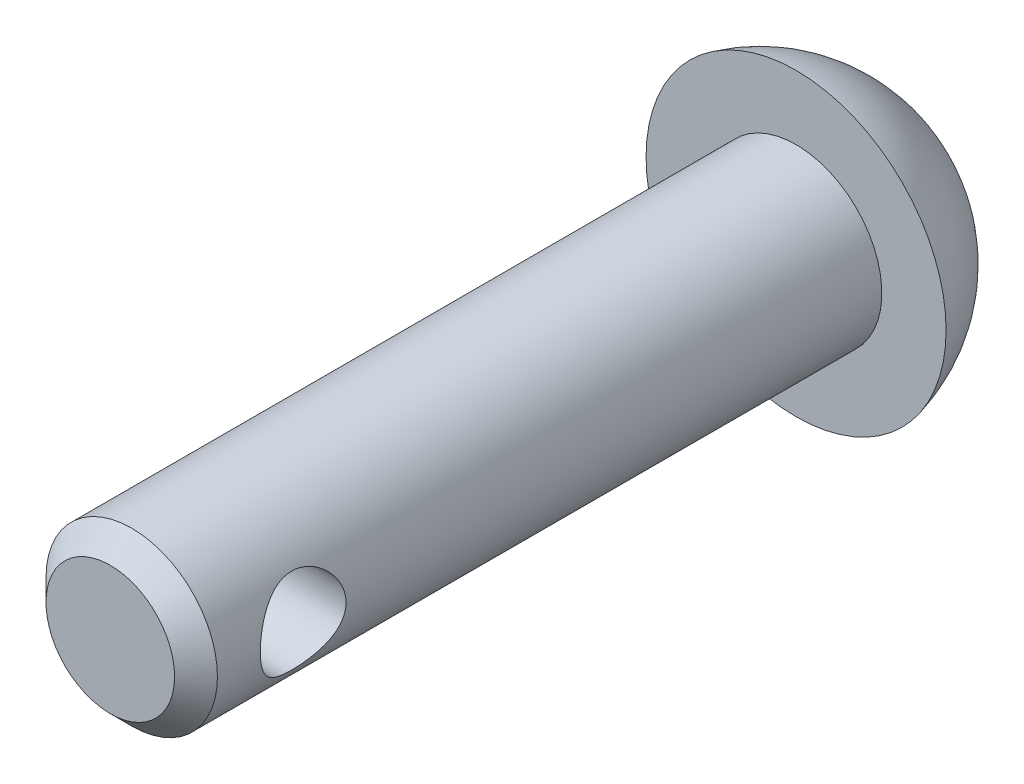
ISO-10303-21;
HEADER;
FILE_DESCRIPTION(('STEP AP214'),'2;1');
FILE_NAME('part.step','',(''),(''),'','','');
FILE_SCHEMA(('AUTOMOTIVE_DESIGN { 1 0 10303 214 1 1 1 1 }'));
ENDSEC;
DATA;
#1=APPLICATION_CONTEXT('core data for automotive mechanical design processes');
#2=APPLICATION_PROTOCOL_DEFINITION('international standard','automotive_design',2000,#1);
#3=PRODUCT_CONTEXT('',#1,'mechanical');
#4=PRODUCT('Part','Part','',(#3));
#5=PRODUCT_RELATED_PRODUCT_CATEGORY('part','',(#4));
#6=PRODUCT_DEFINITION_FORMATION('','',#4);
#7=PRODUCT_DEFINITION_CONTEXT('part definition',#1,'design');
#8=PRODUCT_DEFINITION('design','',#6,#7);
#9=PRODUCT_DEFINITION_SHAPE('','',#8);
#10=(LENGTH_UNIT() NAMED_UNIT(*) SI_UNIT(.MILLI.,.METRE.));
#11=(NAMED_UNIT(*) PLANE_ANGLE_UNIT() SI_UNIT($,.RADIAN.));
#12=(NAMED_UNIT(*) SI_UNIT($,.STERADIAN.) SOLID_ANGLE_UNIT());
#13=UNCERTAINTY_MEASURE_WITH_UNIT(LENGTH_MEASURE(1.E-05),#10,'distance_accuracy_value','');
#14=(GEOMETRIC_REPRESENTATION_CONTEXT(3) GLOBAL_UNCERTAINTY_ASSIGNED_CONTEXT((#13)) GLOBAL_UNIT_ASSIGNED_CONTEXT((#10,
#11,#12)) REPRESENTATION_CONTEXT('',''));
#15=CARTESIAN_POINT('',(0.,0.,0.));
#16=DIRECTION('',(0.,0.,1.));
#17=DIRECTION('',(1.,0.,0.));
#18=AXIS2_PLACEMENT_3D('',#15,#16,#17);
#19=CARTESIAN_POINT('',(0.,0.,8.));
#20=DIRECTION('',(0.,0.,-1.));
#21=DIRECTION('',(-1.,0.,0.));
#22=AXIS2_PLACEMENT_3D('',#19,#20,#21);
#23=CYLINDRICAL_SURFACE('',#22,2.);
#24=CARTESIAN_POINT('',(0.,0.,7.5));
#25=DIRECTION('',(0.,0.,1.));
#26=DIRECTION('',(1.,0.,0.));
#27=AXIS2_PLACEMENT_3D('',#24,#25,#26);
#28=CIRCLE('',#27,2.);
#29=CARTESIAN_POINT('',(2.,0.,7.5));
#30=VERTEX_POINT('',#29);
#31=EDGE_CURVE('E10',#30,#30,#28,.F.);
#32=ORIENTED_EDGE('',*,*,#31,.T.);
#33=EDGE_LOOP('',(#32));
#34=FACE_BOUND('',#33,.T.);
#35=CARTESIAN_POINT('',(-2.,0.,6.5));
#36=CARTESIAN_POINT('',(-1.99999713404151,-0.0525719629529865,6.4999966976805));
#37=CARTESIAN_POINT('',(-1.99790491019518,-0.105206599698033,6.49582992687832));
#38=CARTESIAN_POINT('',(-1.98974156037396,-0.208920235268425,6.47934711965908));
#39=CARTESIAN_POINT('',(-1.98366287828984,-0.259996086713504,6.46701560700235));
#40=CARTESIAN_POINT('',(-1.96816279403312,-0.358933544880574,6.4348061913832));
#41=CARTESIAN_POINT('',(-1.9587543917752,-0.40680680293918,6.41495761575199));
#42=CARTESIAN_POINT('',(-1.93745776515779,-0.498472616806565,6.36842937863506));
#43=CARTESIAN_POINT('',(-1.9255697363353,-0.54226549399005,6.34175025575115));
#44=CARTESIAN_POINT('',(-1.89956258258057,-0.627507817761919,6.2804827505147));
#45=CARTESIAN_POINT('',(-1.88535199127536,-0.668655211122112,6.24551352076036));
#46=CARTESIAN_POINT('',(-1.85659970246744,-0.744779444866977,6.16947852075297));
#47=CARTESIAN_POINT('',(-1.84205776209035,-0.779751583106766,6.12840814822756));
#48=CARTESIAN_POINT('',(-1.81298951197347,-0.845252000450278,6.03751665047662));
#49=CARTESIAN_POINT('',(-1.79855186970132,-0.875225335551637,5.98726390165409));
#50=CARTESIAN_POINT('',(-1.77285978772321,-0.926168226890695,5.88163266401379));
#51=CARTESIAN_POINT('',(-1.7616030760699,-0.947144214966334,5.82625787127725));
#52=CARTESIAN_POINT('',(-1.74457867037809,-0.978132442188588,5.71533489457808));
#53=CARTESIAN_POINT('',(-1.73852271583714,-0.988725857080441,5.65999554793261));
#54=CARTESIAN_POINT('',(-1.73181889948528,-1.00042699330885,5.54802116222052));
#55=CARTESIAN_POINT('',(-1.73116569343288,-1.00154408837307,5.49138745912884));
#56=CARTESIAN_POINT('',(-1.73510930257248,-0.994687287172294,5.38571397568463));
#57=CARTESIAN_POINT('',(-1.73908763662014,-0.987784559536821,5.33657596877695));
#58=CARTESIAN_POINT('',(-1.7507622873385,-0.966939849056932,5.24027809062696));
#59=CARTESIAN_POINT('',(-1.75845978831776,-0.952995623897651,5.19311885469468));
#60=CARTESIAN_POINT('',(-1.77687476412741,-0.918209780386003,5.10077086743434));
#61=CARTESIAN_POINT('',(-1.78765840663999,-0.897215067115994,5.05565360121421));
#62=CARTESIAN_POINT('',(-1.81103404281404,-0.849041687668002,4.96936570740999));
#63=CARTESIAN_POINT('',(-1.82362684780191,-0.821860243812467,4.92819686439991));
#64=CARTESIAN_POINT('',(-1.85113157903286,-0.758066054912788,4.84547874725677));
#65=CARTESIAN_POINT('',(-1.86613510236746,-0.720694458369281,4.80454312642384));
#66=CARTESIAN_POINT('',(-1.89547623300407,-0.639555578741373,4.7292645814091));
#67=CARTESIAN_POINT('',(-1.90981351958801,-0.595785256574285,4.69492480796612));
#68=CARTESIAN_POINT('',(-1.93701987282964,-0.500516505831848,4.63231433897027));
#69=CARTESIAN_POINT('',(-1.94978984162007,-0.448753591599408,4.60439952755426));
#70=CARTESIAN_POINT('',(-1.97157881121242,-0.340466215488797,4.55790297095699));
#71=CARTESIAN_POINT('',(-1.98060078943553,-0.283945576265277,4.53931381498483));
#72=CARTESIAN_POINT('',(-1.99324333741436,-0.172766491660702,4.51352459628332));
#73=CARTESIAN_POINT('',(-1.99724938301312,-0.118341530548324,4.50550876425322));
#74=CARTESIAN_POINT('',(-2.00073013459102,-0.00877959994935354,4.49853526886551));
#75=CARTESIAN_POINT('',(-2.00020698721312,0.0463570198699015,4.49957331436052));
#76=CARTESIAN_POINT('',(-1.99491192253441,0.151232971985994,4.51020668841875));
#77=CARTESIAN_POINT('',(-1.9904724568819,0.201059408049954,4.51913253273003));
#78=CARTESIAN_POINT('',(-1.97822171314819,0.298406892301917,4.54423807189509));
#79=CARTESIAN_POINT('',(-1.97041006334332,0.345927685690997,4.56041856645336));
#80=CARTESIAN_POINT('',(-1.95184251413669,0.438888608449665,4.59999846643317));
#81=CARTESIAN_POINT('',(-1.94100881769939,0.484230397006154,4.62359105011681));
#82=CARTESIAN_POINT('',(-1.91743974317109,0.570461361698921,4.67710753564604));
#83=CARTESIAN_POINT('',(-1.90470355565785,0.611348629775282,4.70703413459343));
#84=CARTESIAN_POINT('',(-1.87708221337464,0.691767689290653,4.77576042533287));
#85=CARTESIAN_POINT('',(-1.86210884848441,0.730772077824639,4.81514286845356));
#86=CARTESIAN_POINT('',(-1.83262391603874,0.80185632111324,4.8999251512693));
#87=CARTESIAN_POINT('',(-1.81811267381526,0.833931385690841,4.94532911881637));
#88=CARTESIAN_POINT('',(-1.79051192226068,0.891707914497696,5.04364365420031));
#89=CARTESIAN_POINT('',(-1.77752529663472,0.917025495878638,5.0968112662086));
#90=CARTESIAN_POINT('',(-1.75574072368126,0.958082826013803,5.20751006769252));
#91=CARTESIAN_POINT('',(-1.74693738240618,0.97383491588757,5.26503552650119));
#92=CARTESIAN_POINT('',(-1.73561501008667,0.993861687449679,5.37691022286145));
#93=CARTESIAN_POINT('',(-1.73257383460491,0.999092996400865,5.43103425342904));
#94=CARTESIAN_POINT('',(-1.73165354646175,1.00068915438079,5.53944706717073));
#95=CARTESIAN_POINT('',(-1.73377219627553,0.997057846624399,5.59373576873943));
#96=CARTESIAN_POINT('',(-1.74237862050025,0.981926125592263,5.69548350153202));
#97=CARTESIAN_POINT('',(-1.74843094482394,0.971208314342799,5.7431004701444));
#98=CARTESIAN_POINT('',(-1.76371016187918,0.943175358224645,5.83580811942471));
#99=CARTESIAN_POINT('',(-1.77293807569676,0.92585809115981,5.88089798209197));
#100=CARTESIAN_POINT('',(-1.79428530364528,0.883815745300683,5.97062485098661));
#101=CARTESIAN_POINT('',(-1.80655722396191,0.858671137816458,6.0150279018297));
#102=CARTESIAN_POINT('',(-1.8323533163459,0.802150971636634,6.09927453618059));
#103=CARTESIAN_POINT('',(-1.84587813794522,0.770772171238648,6.13911573051849));
#104=CARTESIAN_POINT('',(-1.87462323159313,0.69820332666464,6.21814198235761));
#105=CARTESIAN_POINT('',(-1.88984983311469,0.656284423010171,6.25665910236192));
#106=CARTESIAN_POINT('',(-1.91877752255088,0.566154806220279,6.32626298342363));
#107=CARTESIAN_POINT('',(-1.9324777860804,0.517940723256785,6.35734573942629));
#108=CARTESIAN_POINT('',(-1.95698009585103,0.415931596819947,6.4112363627622));
#109=CARTESIAN_POINT('',(-1.96776096562909,0.362099503934615,6.43398416941143));
#110=CARTESIAN_POINT('',(-1.98501341363465,0.250742101294191,6.46980816791895));
#111=CARTESIAN_POINT('',(-1.99149723372932,0.193227799623166,6.48291184682958));
#112=CARTESIAN_POINT('',(-1.99695461909663,0.112601946483384,6.49389741107585));
#113=CARTESIAN_POINT('',(-1.99809365339202,0.0901618794394986,6.49618264086362));
#114=CARTESIAN_POINT('',(-1.99961696977865,0.0451517318071576,6.49923466551681));
#115=CARTESIAN_POINT('',(-2.00000123103763,0.0225816476473814,6.5000014184712));
#116=CARTESIAN_POINT('',(-2.,0.,6.5));
#117=B_SPLINE_CURVE_WITH_KNOTS('',3,(#35,#36,#37,#38,#39,#40,#41,#42,#43,#44,#45,#46,#47,#48,
#49,#50,#51,#52,#53,#54,#55,#56,#57,#58,#59,#60,#61,#62,#63,#64,#65,#66,#67,#68,#69,#70,#71,#72,
#73,#74,#75,#76,#77,#78,#79,#80,#81,#82,#83,#84,#85,#86,#87,#88,#89,#90,#91,#92,#93,#94,#95,#96,
#97,#98,#99,#100,#101,#102,#103,#104,#105,#106,#107,#108,#109,#110,#111,#112,#113,#114,#115,
#116),.UNSPECIFIED.,.T.,.F.,(4,2,2,2,2,2,2,2,2,2,2,2,2,2,2,2,2,2,2,2,2,2,2,2,2,2,2,2,2,2,2,2,2,
2,2,2,2,2,2,2,4),(0.,0.157624257420293,0.315548149709198,0.472862155492299,0.630163760581568,
0.796981758718089,0.963926237654035,1.14381726430753,1.32357947898281,1.49258012140229,
1.6614135732902,1.81005712409321,1.95874803925678,2.11090240168487,2.26312521260222,
2.43464941333878,2.60625534598686,2.78583022214441,2.96526216912279,3.12983290471346,
3.29432564511476,3.44606906506122,3.59782921630931,3.75392856027899,3.91009450748339,
4.08159610644419,4.25321588615432,4.43314682159674,4.61284511940777,4.77529307498373,
4.93767059860005,5.08457930244182,5.23153528783678,5.38836456775614,5.54527561138957,
5.72125242752498,5.89732383376572,6.07464013662925,6.2514490862493,6.31915280137697,
6.38685838514846),.UNSPECIFIED.);
#118=CARTESIAN_POINT('',(-2.,0.,6.5));
#119=VERTEX_POINT('',#118);
#120=EDGE_CURVE('E57',#119,#119,#117,.T.);
#121=ORIENTED_EDGE('',*,*,#120,.T.);
#122=EDGE_LOOP('',(#121));
#123=FACE_BOUND('',#122,.T.);
#124=CARTESIAN_POINT('',(2.,0.,4.5));
#125=CARTESIAN_POINT('',(1.99999713404151,-0.0525719629529865,4.5000033023195));
#126=CARTESIAN_POINT('',(1.99790491019518,-0.105206599698033,4.50417007312167));
#127=CARTESIAN_POINT('',(1.98974156037396,-0.208920235268425,4.52065288034092));
#128=CARTESIAN_POINT('',(1.98366287828984,-0.259996086713504,4.53298439299765));
#129=CARTESIAN_POINT('',(1.96816279403312,-0.358933544880574,4.56519380861679));
#130=CARTESIAN_POINT('',(1.9587543917752,-0.40680680293918,4.58504238424801));
#131=CARTESIAN_POINT('',(1.93745776515779,-0.498472616806565,4.63157062136494));
#132=CARTESIAN_POINT('',(1.9255697363353,-0.54226549399005,4.65824974424885));
#133=CARTESIAN_POINT('',(1.89956258258057,-0.627507817761919,4.7195172494853));
#134=CARTESIAN_POINT('',(1.88535199127536,-0.668655211122112,4.75448647923964));
#135=CARTESIAN_POINT('',(1.85659970246744,-0.744779444866977,4.83052147924703));
#136=CARTESIAN_POINT('',(1.84205776209035,-0.779751583106766,4.87159185177244));
#137=CARTESIAN_POINT('',(1.81298951197347,-0.845252000450278,4.96248334952338));
#138=CARTESIAN_POINT('',(1.79855186970132,-0.875225335551637,5.01273609834591));
#139=CARTESIAN_POINT('',(1.77285978772321,-0.926168226890695,5.11836733598621));
#140=CARTESIAN_POINT('',(1.7616030760699,-0.947144214966334,5.17374212872275));
#141=CARTESIAN_POINT('',(1.74457867037809,-0.978132442188588,5.28466510542192));
#142=CARTESIAN_POINT('',(1.73852271583714,-0.988725857080441,5.34000445206739));
#143=CARTESIAN_POINT('',(1.73181889948528,-1.00042699330885,5.45197883777948));
#144=CARTESIAN_POINT('',(1.73116569343288,-1.00154408837307,5.50861254087115));
#145=CARTESIAN_POINT('',(1.73510930257248,-0.994687287172294,5.61428602431537));
#146=CARTESIAN_POINT('',(1.73908763662014,-0.987784559536821,5.66342403122305));
#147=CARTESIAN_POINT('',(1.7507622873385,-0.966939849056932,5.75972190937304));
#148=CARTESIAN_POINT('',(1.75845978831776,-0.952995623897651,5.80688114530532));
#149=CARTESIAN_POINT('',(1.77687476412741,-0.918209780386003,5.89922913256566));
#150=CARTESIAN_POINT('',(1.78765840663999,-0.897215067115994,5.94434639878579));
#151=CARTESIAN_POINT('',(1.81103404281404,-0.849041687668002,6.03063429259001));
#152=CARTESIAN_POINT('',(1.82362684780191,-0.821860243812467,6.07180313560009));
#153=CARTESIAN_POINT('',(1.85113157903286,-0.758066054912788,6.15452125274323));
#154=CARTESIAN_POINT('',(1.86613510236746,-0.720694458369281,6.19545687357616));
#155=CARTESIAN_POINT('',(1.89547623300407,-0.639555578741373,6.2707354185909));
#156=CARTESIAN_POINT('',(1.90981351958801,-0.595785256574285,6.30507519203388));
#157=CARTESIAN_POINT('',(1.93701987282964,-0.500516505831848,6.36768566102973));
#158=CARTESIAN_POINT('',(1.94978984162007,-0.448753591599408,6.39560047244574));
#159=CARTESIAN_POINT('',(1.97157881121242,-0.340466215488797,6.44209702904301));
#160=CARTESIAN_POINT('',(1.98060078943553,-0.283945576265277,6.46068618501517));
#161=CARTESIAN_POINT('',(1.99324333741436,-0.172766491660702,6.48647540371667));
#162=CARTESIAN_POINT('',(1.99724938301312,-0.118341530548324,6.49449123574678));
#163=CARTESIAN_POINT('',(2.00073013459102,-0.00877959994935354,6.50146473113449));
#164=CARTESIAN_POINT('',(2.00020698721312,0.0463570198699015,6.50042668563948));
#165=CARTESIAN_POINT('',(1.99491192253441,0.151232971985994,6.48979331158125));
#166=CARTESIAN_POINT('',(1.9904724568819,0.201059408049954,6.48086746726997));
#167=CARTESIAN_POINT('',(1.97822171314819,0.298406892301917,6.45576192810491));
#168=CARTESIAN_POINT('',(1.97041006334332,0.345927685690997,6.43958143354664));
#169=CARTESIAN_POINT('',(1.95184251413669,0.438888608449665,6.40000153356683));
#170=CARTESIAN_POINT('',(1.94100881769939,0.484230397006154,6.37640894988319));
#171=CARTESIAN_POINT('',(1.91743974317109,0.570461361698921,6.32289246435396));
#172=CARTESIAN_POINT('',(1.90470355565785,0.611348629775282,6.29296586540657));
#173=CARTESIAN_POINT('',(1.87708221337464,0.691767689290653,6.22423957466713));
#174=CARTESIAN_POINT('',(1.86210884848441,0.730772077824639,6.18485713154643));
#175=CARTESIAN_POINT('',(1.83262391603874,0.80185632111324,6.1000748487307));
#176=CARTESIAN_POINT('',(1.81811267381526,0.833931385690841,6.05467088118363));
#177=CARTESIAN_POINT('',(1.79051192226068,0.891707914497696,5.95635634579969));
#178=CARTESIAN_POINT('',(1.77752529663472,0.917025495878638,5.9031887337914));
#179=CARTESIAN_POINT('',(1.75574072368126,0.958082826013803,5.79248993230748));
#180=CARTESIAN_POINT('',(1.74693738240618,0.97383491588757,5.73496447349881));
#181=CARTESIAN_POINT('',(1.73561501008667,0.993861687449679,5.62308977713855));
#182=CARTESIAN_POINT('',(1.73257383460491,0.999092996400865,5.56896574657096));
#183=CARTESIAN_POINT('',(1.73165354646175,1.00068915438079,5.46055293282927));
#184=CARTESIAN_POINT('',(1.73377219627553,0.997057846624399,5.40626423126057));
#185=CARTESIAN_POINT('',(1.74237862050025,0.981926125592263,5.30451649846798));
#186=CARTESIAN_POINT('',(1.74843094482394,0.971208314342799,5.2568995298556));
#187=CARTESIAN_POINT('',(1.76371016187918,0.943175358224645,5.16419188057529));
#188=CARTESIAN_POINT('',(1.77293807569676,0.92585809115981,5.11910201790803));
#189=CARTESIAN_POINT('',(1.79428530364528,0.883815745300683,5.02937514901339));
#190=CARTESIAN_POINT('',(1.80655722396191,0.858671137816458,4.9849720981703));
#191=CARTESIAN_POINT('',(1.8323533163459,0.802150971636634,4.90072546381941));
#192=CARTESIAN_POINT('',(1.84587813794522,0.770772171238648,4.86088426948151));
#193=CARTESIAN_POINT('',(1.87462323159313,0.69820332666464,4.78185801764238));
#194=CARTESIAN_POINT('',(1.88984983311469,0.656284423010171,4.74334089763808));
#195=CARTESIAN_POINT('',(1.91877752255088,0.566154806220279,4.67373701657637));
#196=CARTESIAN_POINT('',(1.9324777860804,0.517940723256785,4.64265426057371));
#197=CARTESIAN_POINT('',(1.95698009585103,0.415931596819947,4.5887636372378));
#198=CARTESIAN_POINT('',(1.96776096562909,0.362099503934615,4.56601583058857));
#199=CARTESIAN_POINT('',(1.98501341363465,0.250742101294191,4.53019183208105));
#200=CARTESIAN_POINT('',(1.99149723372932,0.193227799623166,4.51708815317042));
#201=CARTESIAN_POINT('',(1.99695461909663,0.112601946483384,4.50610258892415));
#202=CARTESIAN_POINT('',(1.99809365339202,0.0901618794394986,4.50381735913638));
#203=CARTESIAN_POINT('',(1.99961696977865,0.0451517318071576,4.50076533448319));
#204=CARTESIAN_POINT('',(2.00000123103763,0.0225816476473814,4.4999985815288));
#205=CARTESIAN_POINT('',(2.,0.,4.5));
#206=B_SPLINE_CURVE_WITH_KNOTS('',3,(#124,#125,#126,#127,#128,#129,#130,#131,#132,#133,#134,
#135,#136,#137,#138,#139,#140,#141,#142,#143,#144,#145,#146,#147,#148,#149,#150,#151,#152,#153,
#154,#155,#156,#157,#158,#159,#160,#161,#162,#163,#164,#165,#166,#167,#168,#169,#170,#171,#172,
#173,#174,#175,#176,#177,#178,#179,#180,#181,#182,#183,#184,#185,#186,#187,#188,#189,#190,#191,
#192,#193,#194,#195,#196,#197,#198,#199,#200,#201,#202,#203,#204,#205),.UNSPECIFIED.,.T.,.F.,(4,
2,2,2,2,2,2,2,2,2,2,2,2,2,2,2,2,2,2,2,2,2,2,2,2,2,2,2,2,2,2,2,2,2,2,2,2,2,2,2,4),(0.,
0.157624257420293,0.315548149709198,0.472862155492299,0.630163760581568,0.796981758718089,
0.963926237654035,1.14381726430753,1.32357947898281,1.49258012140229,1.6614135732902,
1.81005712409321,1.95874803925678,2.11090240168487,2.26312521260222,2.43464941333878,
2.60625534598686,2.78583022214441,2.96526216912279,3.12983290471346,3.29432564511476,
3.44606906506122,3.59782921630931,3.75392856027899,3.91009450748339,4.08159610644419,
4.25321588615432,4.43314682159674,4.61284511940777,4.77529307498373,4.93767059860005,
5.08457930244182,5.23153528783678,5.38836456775614,5.54527561138957,5.72125242752498,
5.89732383376572,6.07464013662925,6.2514490862493,6.31915280137697,6.38685838514846),.UNSPECIFIED.);
#207=CARTESIAN_POINT('',(2.,0.,4.5));
#208=VERTEX_POINT('',#207);
#209=EDGE_CURVE('E64',#208,#208,#206,.T.);
#210=ORIENTED_EDGE('',*,*,#209,.T.);
#211=EDGE_LOOP('',(#210));
#212=FACE_BOUND('',#211,.T.);
#213=CARTESIAN_POINT('',(0.,0.,-8.));
#214=DIRECTION('',(0.,0.,-1.));
#215=DIRECTION('',(-1.,0.,0.));
#216=AXIS2_PLACEMENT_3D('',#213,#214,#215);
#217=CIRCLE('',#216,2.);
#218=CARTESIAN_POINT('',(-2.,0.,-8.));
#219=VERTEX_POINT('',#218);
#220=EDGE_CURVE('E50',#219,#219,#217,.T.);
#221=ORIENTED_EDGE('',*,*,#220,.F.);
#222=EDGE_LOOP('',(#221));
#223=FACE_BOUND('',#222,.T.);
#224=ADVANCED_FACE('F38',(#34,#123,#212,#223),#23,.T.);
#225=CARTESIAN_POINT('',(0.,0.,8.));
#226=DIRECTION('',(0.,0.,1.));
#227=DIRECTION('',(1.,0.,0.));
#228=AXIS2_PLACEMENT_3D('',#225,#226,#227);
#229=PLANE('',#228);
#230=CARTESIAN_POINT('',(0.,0.,8.));
#231=DIRECTION('',(0.,0.,1.));
#232=DIRECTION('',(1.,0.,0.));
#233=AXIS2_PLACEMENT_3D('',#230,#231,#232);
#234=CIRCLE('',#233,1.5);
#235=CARTESIAN_POINT('',(1.5,0.,8.));
#236=VERTEX_POINT('',#235);
#237=EDGE_CURVE('E46',#236,#236,#234,.T.);
#238=ORIENTED_EDGE('',*,*,#237,.T.);
#239=EDGE_LOOP('',(#238));
#240=FACE_BOUND('',#239,.T.);
#241=ADVANCED_FACE('F82',(#240),#229,.T.);
#242=CARTESIAN_POINT('',(0.,3.5,-8.));
#243=DIRECTION('',(0.,0.,-1.));
#244=DIRECTION('',(-1.,0.,0.));
#245=AXIS2_PLACEMENT_3D('',#242,#243,#244);
#246=PLANE('',#245);
#247=ORIENTED_EDGE('',*,*,#220,.T.);
#248=EDGE_LOOP('',(#247));
#249=FACE_BOUND('',#248,.T.);
#250=CARTESIAN_POINT('',(0.,0.,-8.));
#251=DIRECTION('',(0.,0.,1.));
#252=DIRECTION('',(1.,0.,0.));
#253=AXIS2_PLACEMENT_3D('',#250,#251,#252);
#254=CIRCLE('',#253,3.5);
#255=CARTESIAN_POINT('',(3.5,0.,-8.));
#256=VERTEX_POINT('',#255);
#257=EDGE_CURVE('E54',#256,#256,#254,.T.);
#258=ORIENTED_EDGE('',*,*,#257,.T.);
#259=EDGE_LOOP('',(#258));
#260=FACE_BOUND('',#259,.T.);
#261=ADVANCED_FACE('F79',(#249,#260),#246,.F.);
#262=CARTESIAN_POINT('',(0.,0.,-7.15738502268236));
#263=DIRECTION('',(0.,0.,1.));
#264=DIRECTION('',(0.,1.,0.));
#265=AXIS2_PLACEMENT_3D('',#262,#263,#264);
#266=SPHERICAL_SURFACE('',#265,3.6);
#267=ORIENTED_EDGE('',*,*,#257,.F.);
#268=EDGE_LOOP('',(#267));
#269=FACE_BOUND('',#268,.T.);
#270=ADVANCED_FACE('F74',(#269),#266,.T.);
#271=CARTESIAN_POINT('',(-3.5,0.,5.5));
#272=DIRECTION('',(1.,0.,0.));
#273=DIRECTION('',(0.,0.,-1.));
#274=AXIS2_PLACEMENT_3D('',#271,#272,#273);
#275=CYLINDRICAL_SURFACE('',#274,1.);
#276=ORIENTED_EDGE('',*,*,#209,.F.);
#277=EDGE_LOOP('',(#276));
#278=FACE_BOUND('',#277,.T.);
#279=ORIENTED_EDGE('',*,*,#120,.F.);
#280=EDGE_LOOP('',(#279));
#281=FACE_BOUND('',#280,.T.);
#282=ADVANCED_FACE('F70',(#278,#281),#275,.F.);
#283=CARTESIAN_POINT('',(0.,0.,8.));
#284=DIRECTION('',(0.,0.,-1.));
#285=DIRECTION('',(-1.,0.,0.));
#286=AXIS2_PLACEMENT_3D('',#283,#284,#285);
#287=CONICAL_SURFACE('',#286,1.5,0.785398163397448);
#288=ORIENTED_EDGE('',*,*,#31,.F.);
#289=EDGE_LOOP('',(#288));
#290=FACE_BOUND('',#289,.T.);
#291=ORIENTED_EDGE('',*,*,#237,.F.);
#292=EDGE_LOOP('',(#291));
#293=FACE_BOUND('',#292,.T.);
#294=ADVANCED_FACE('F41',(#290,#293),#287,.T.);
#295=CLOSED_SHELL('',(#224,#241,#261,#270,#282,#294));
#296=MANIFOLD_SOLID_BREP('B2',#295);
#297=ADVANCED_BREP_SHAPE_REPRESENTATION('',(#18,#296),#14);
#298=SHAPE_DEFINITION_REPRESENTATION(#9,#297);
ENDSEC;
END-ISO-10303-21;
